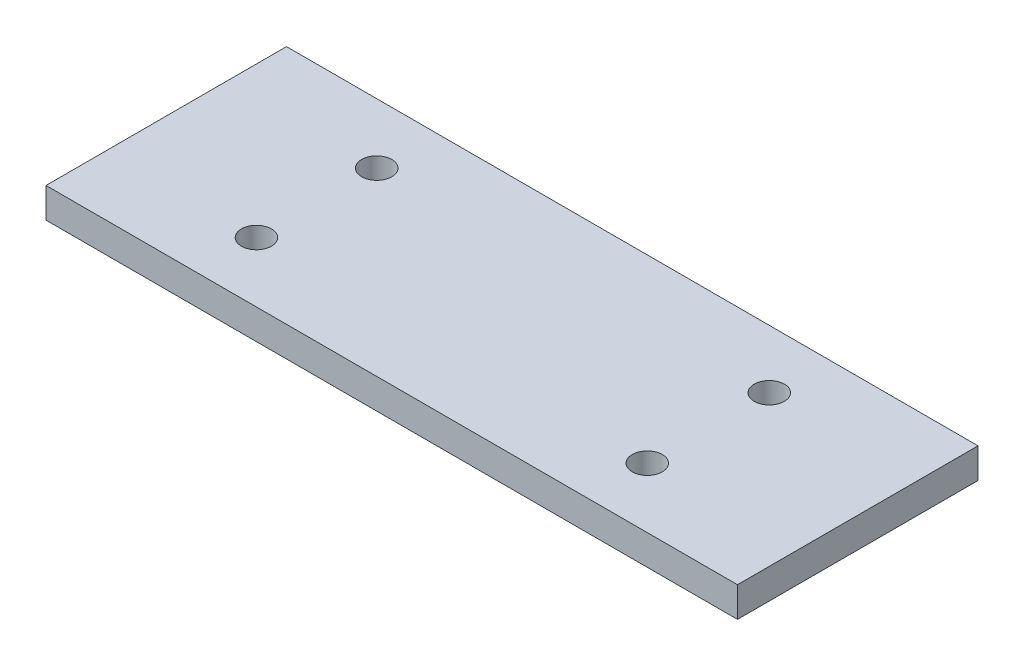
ISO-10303-21;
HEADER;
FILE_DESCRIPTION(('STEP AP214'),'2;1');
FILE_NAME('part.step','',(''),(''),'','','');
FILE_SCHEMA(('AUTOMOTIVE_DESIGN { 1 0 10303 214 1 1 1 1 }'));
ENDSEC;
DATA;
#1=APPLICATION_CONTEXT('core data for automotive mechanical design processes');
#2=APPLICATION_PROTOCOL_DEFINITION('international standard','automotive_design',2000,#1);
#3=PRODUCT_CONTEXT('',#1,'mechanical');
#4=PRODUCT('Part','Part','',(#3));
#5=PRODUCT_RELATED_PRODUCT_CATEGORY('part','',(#4));
#6=PRODUCT_DEFINITION_FORMATION('','',#4);
#7=PRODUCT_DEFINITION_CONTEXT('part definition',#1,'design');
#8=PRODUCT_DEFINITION('design','',#6,#7);
#9=PRODUCT_DEFINITION_SHAPE('','',#8);
#10=(LENGTH_UNIT() NAMED_UNIT(*) SI_UNIT(.MILLI.,.METRE.));
#11=(NAMED_UNIT(*) PLANE_ANGLE_UNIT() SI_UNIT($,.RADIAN.));
#12=(NAMED_UNIT(*) SI_UNIT($,.STERADIAN.) SOLID_ANGLE_UNIT());
#13=UNCERTAINTY_MEASURE_WITH_UNIT(LENGTH_MEASURE(1.E-05),#10,'distance_accuracy_value','');
#14=(GEOMETRIC_REPRESENTATION_CONTEXT(3) GLOBAL_UNCERTAINTY_ASSIGNED_CONTEXT((#13)) GLOBAL_UNIT_ASSIGNED_CONTEXT((#10,
#11,#12)) REPRESENTATION_CONTEXT('',''));
#15=CARTESIAN_POINT('',(0.,0.,0.));
#16=DIRECTION('',(0.,0.,1.));
#17=DIRECTION('',(1.,0.,0.));
#18=AXIS2_PLACEMENT_3D('',#15,#16,#17);
#19=CARTESIAN_POINT('',(57.5,2.5,-20.));
#20=DIRECTION('',(-1.,0.,0.));
#21=DIRECTION('',(0.,0.,1.));
#22=AXIS2_PLACEMENT_3D('',#19,#20,#21);
#23=PLANE('',#22);
#24=DIRECTION('',(0.,0.,-1.));
#25=VECTOR('',#24,1.);
#26=CARTESIAN_POINT('',(57.5,-2.5,-20.));
#27=LINE('',#26,#25);
#28=CARTESIAN_POINT('',(57.5,-2.5,20.));
#29=VERTEX_POINT('',#28);
#30=CARTESIAN_POINT('',(57.5,-2.5,-20.));
#31=VERTEX_POINT('',#30);
#32=EDGE_CURVE('E96',#29,#31,#27,.T.);
#33=ORIENTED_EDGE('',*,*,#32,.T.);
#34=DIRECTION('',(0.,-1.,0.));
#35=VECTOR('',#34,1.);
#36=CARTESIAN_POINT('',(57.5,2.5,-20.));
#37=LINE('',#36,#35);
#38=CARTESIAN_POINT('',(57.5,2.5,-20.));
#39=VERTEX_POINT('',#38);
#40=EDGE_CURVE('E11',#39,#31,#37,.T.);
#41=ORIENTED_EDGE('',*,*,#40,.F.);
#42=DIRECTION('',(0.,0.,-1.));
#43=VECTOR('',#42,1.);
#44=CARTESIAN_POINT('',(57.5,2.5,-20.));
#45=LINE('',#44,#43);
#46=CARTESIAN_POINT('',(57.5,2.5,20.));
#47=VERTEX_POINT('',#46);
#48=EDGE_CURVE('E84',#47,#39,#45,.T.);
#49=ORIENTED_EDGE('',*,*,#48,.F.);
#50=DIRECTION('',(0.,-1.,0.));
#51=VECTOR('',#50,1.);
#52=CARTESIAN_POINT('',(57.5,2.5,20.));
#53=LINE('',#52,#51);
#54=EDGE_CURVE('E92',#47,#29,#53,.T.);
#55=ORIENTED_EDGE('',*,*,#54,.T.);
#56=EDGE_LOOP('',(#33,#41,#49,#55));
#57=FACE_BOUND('',#56,.T.);
#58=ADVANCED_FACE('F33',(#57),#23,.F.);
#59=CARTESIAN_POINT('',(-57.5,2.5,-20.));
#60=DIRECTION('',(0.,0.,1.));
#61=DIRECTION('',(1.,0.,0.));
#62=AXIS2_PLACEMENT_3D('',#59,#60,#61);
#63=PLANE('',#62);
#64=DIRECTION('',(-1.,0.,0.));
#65=VECTOR('',#64,1.);
#66=CARTESIAN_POINT('',(-57.5,-2.5,-20.));
#67=LINE('',#66,#65);
#68=CARTESIAN_POINT('',(-57.5,-2.5,-20.));
#69=VERTEX_POINT('',#68);
#70=EDGE_CURVE('E88',#31,#69,#67,.T.);
#71=ORIENTED_EDGE('',*,*,#70,.T.);
#72=DIRECTION('',(0.,-1.,0.));
#73=VECTOR('',#72,1.);
#74=CARTESIAN_POINT('',(-57.5,2.5,-20.));
#75=LINE('',#74,#73);
#76=CARTESIAN_POINT('',(-57.5,2.5,-20.));
#77=VERTEX_POINT('',#76);
#78=EDGE_CURVE('E41',#77,#69,#75,.T.);
#79=ORIENTED_EDGE('',*,*,#78,.F.);
#80=DIRECTION('',(-1.,0.,0.));
#81=VECTOR('',#80,1.);
#82=CARTESIAN_POINT('',(-57.5,2.5,-20.));
#83=LINE('',#82,#81);
#84=EDGE_CURVE('E79',#39,#77,#83,.T.);
#85=ORIENTED_EDGE('',*,*,#84,.F.);
#86=ORIENTED_EDGE('',*,*,#40,.T.);
#87=EDGE_LOOP('',(#71,#79,#85,#86));
#88=FACE_BOUND('',#87,.T.);
#89=ADVANCED_FACE('F87',(#88),#63,.F.);
#90=CARTESIAN_POINT('',(-57.5,2.5,-20.));
#91=DIRECTION('',(1.,0.,0.));
#92=DIRECTION('',(0.,0.,-1.));
#93=AXIS2_PLACEMENT_3D('',#90,#91,#92);
#94=PLANE('',#93);
#95=DIRECTION('',(0.,0.,1.));
#96=VECTOR('',#95,1.);
#97=CARTESIAN_POINT('',(-57.5,-2.5,-20.));
#98=LINE('',#97,#96);
#99=CARTESIAN_POINT('',(-57.5,-2.5,20.));
#100=VERTEX_POINT('',#99);
#101=EDGE_CURVE('E66',#69,#100,#98,.T.);
#102=ORIENTED_EDGE('',*,*,#101,.T.);
#103=DIRECTION('',(0.,-1.,0.));
#104=VECTOR('',#103,1.);
#105=CARTESIAN_POINT('',(-57.5,2.5,20.));
#106=LINE('',#105,#104);
#107=CARTESIAN_POINT('',(-57.5,2.5,20.));
#108=VERTEX_POINT('',#107);
#109=EDGE_CURVE('E89',#108,#100,#106,.T.);
#110=ORIENTED_EDGE('',*,*,#109,.F.);
#111=DIRECTION('',(0.,0.,1.));
#112=VECTOR('',#111,1.);
#113=CARTESIAN_POINT('',(-57.5,2.5,-20.));
#114=LINE('',#113,#112);
#115=EDGE_CURVE('E82',#77,#108,#114,.T.);
#116=ORIENTED_EDGE('',*,*,#115,.F.);
#117=ORIENTED_EDGE('',*,*,#78,.T.);
#118=EDGE_LOOP('',(#102,#110,#116,#117));
#119=FACE_BOUND('',#118,.T.);
#120=ADVANCED_FACE('F90',(#119),#94,.F.);
#121=CARTESIAN_POINT('',(-57.5,2.5,20.));
#122=DIRECTION('',(0.,0.,-1.));
#123=DIRECTION('',(-1.,0.,0.));
#124=AXIS2_PLACEMENT_3D('',#121,#122,#123);
#125=PLANE('',#124);
#126=DIRECTION('',(1.,0.,0.));
#127=VECTOR('',#126,1.);
#128=CARTESIAN_POINT('',(-57.5,-2.5,20.));
#129=LINE('',#128,#127);
#130=EDGE_CURVE('E72',#100,#29,#129,.T.);
#131=ORIENTED_EDGE('',*,*,#130,.T.);
#132=ORIENTED_EDGE('',*,*,#54,.F.);
#133=DIRECTION('',(1.,0.,0.));
#134=VECTOR('',#133,1.);
#135=CARTESIAN_POINT('',(-57.5,2.5,20.));
#136=LINE('',#135,#134);
#137=EDGE_CURVE('E49',#108,#47,#136,.T.);
#138=ORIENTED_EDGE('',*,*,#137,.F.);
#139=ORIENTED_EDGE('',*,*,#109,.T.);
#140=EDGE_LOOP('',(#131,#132,#138,#139));
#141=FACE_BOUND('',#140,.T.);
#142=ADVANCED_FACE('F104',(#141),#125,.F.);
#143=CARTESIAN_POINT('',(0.,2.5,0.));
#144=DIRECTION('',(0.,1.,0.));
#145=DIRECTION('',(0.,0.,1.));
#146=AXIS2_PLACEMENT_3D('',#143,#144,#145);
#147=PLANE('',#146);
#148=CARTESIAN_POINT('',(-32.5,2.5,-10.));
#149=DIRECTION('',(0.,1.,0.));
#150=DIRECTION('',(0.,0.,1.));
#151=AXIS2_PLACEMENT_3D('',#148,#149,#150);
#152=CIRCLE('',#151,2.5);
#153=CARTESIAN_POINT('',(-32.5,2.5,-7.50000000000002));
#154=VERTEX_POINT('',#153);
#155=EDGE_CURVE('E130',#154,#154,#152,.T.);
#156=ORIENTED_EDGE('',*,*,#155,.F.);
#157=EDGE_LOOP('',(#156));
#158=FACE_BOUND('',#157,.T.);
#159=CARTESIAN_POINT('',(-32.5,2.5,9.99999999999999));
#160=DIRECTION('',(0.,1.,0.));
#161=DIRECTION('',(0.,0.,1.));
#162=AXIS2_PLACEMENT_3D('',#159,#160,#161);
#163=CIRCLE('',#162,2.5);
#164=CARTESIAN_POINT('',(-32.5,2.5,12.5));
#165=VERTEX_POINT('',#164);
#166=EDGE_CURVE('E124',#165,#165,#163,.T.);
#167=ORIENTED_EDGE('',*,*,#166,.F.);
#168=EDGE_LOOP('',(#167));
#169=FACE_BOUND('',#168,.T.);
#170=CARTESIAN_POINT('',(32.5,2.5,9.99999999999999));
#171=DIRECTION('',(0.,1.,0.));
#172=DIRECTION('',(0.,0.,1.));
#173=AXIS2_PLACEMENT_3D('',#170,#171,#172);
#174=CIRCLE('',#173,2.5);
#175=CARTESIAN_POINT('',(32.5,2.5,12.5));
#176=VERTEX_POINT('',#175);
#177=EDGE_CURVE('E118',#176,#176,#174,.T.);
#178=ORIENTED_EDGE('',*,*,#177,.F.);
#179=EDGE_LOOP('',(#178));
#180=FACE_BOUND('',#179,.T.);
#181=CARTESIAN_POINT('',(32.5,2.5,-10.2905183854887));
#182=DIRECTION('',(0.,1.,0.));
#183=DIRECTION('',(0.,0.,1.));
#184=AXIS2_PLACEMENT_3D('',#181,#182,#183);
#185=CIRCLE('',#184,2.5);
#186=CARTESIAN_POINT('',(32.5,2.5,-7.79051838548869));
#187=VERTEX_POINT('',#186);
#188=EDGE_CURVE('E112',#187,#187,#185,.T.);
#189=ORIENTED_EDGE('',*,*,#188,.F.);
#190=EDGE_LOOP('',(#189));
#191=FACE_BOUND('',#190,.T.);
#192=ORIENTED_EDGE('',*,*,#48,.T.);
#193=ORIENTED_EDGE('',*,*,#84,.T.);
#194=ORIENTED_EDGE('',*,*,#115,.T.);
#195=ORIENTED_EDGE('',*,*,#137,.T.);
#196=EDGE_LOOP('',(#192,#193,#194,#195));
#197=FACE_BOUND('',#196,.T.);
#198=ADVANCED_FACE('F80',(#158,#169,#180,#191,#197),#147,.T.);
#199=CARTESIAN_POINT('',(0.,-2.5,0.));
#200=DIRECTION('',(0.,1.,0.));
#201=DIRECTION('',(0.,0.,1.));
#202=AXIS2_PLACEMENT_3D('',#199,#200,#201);
#203=PLANE('',#202);
#204=CARTESIAN_POINT('',(-32.5,-2.5,-10.));
#205=DIRECTION('',(0.,1.,0.));
#206=DIRECTION('',(0.,0.,1.));
#207=AXIS2_PLACEMENT_3D('',#204,#205,#206);
#208=CIRCLE('',#207,2.5);
#209=CARTESIAN_POINT('',(-32.5,-2.5,-7.50000000000002));
#210=VERTEX_POINT('',#209);
#211=EDGE_CURVE('E127',#210,#210,#208,.T.);
#212=ORIENTED_EDGE('',*,*,#211,.T.);
#213=EDGE_LOOP('',(#212));
#214=FACE_BOUND('',#213,.T.);
#215=CARTESIAN_POINT('',(-32.5,-2.5,9.99999999999999));
#216=DIRECTION('',(0.,1.,0.));
#217=DIRECTION('',(0.,0.,1.));
#218=AXIS2_PLACEMENT_3D('',#215,#216,#217);
#219=CIRCLE('',#218,2.5);
#220=CARTESIAN_POINT('',(-32.5,-2.5,12.5));
#221=VERTEX_POINT('',#220);
#222=EDGE_CURVE('E121',#221,#221,#219,.T.);
#223=ORIENTED_EDGE('',*,*,#222,.T.);
#224=EDGE_LOOP('',(#223));
#225=FACE_BOUND('',#224,.T.);
#226=CARTESIAN_POINT('',(32.5,-2.5,9.99999999999999));
#227=DIRECTION('',(0.,1.,0.));
#228=DIRECTION('',(0.,0.,1.));
#229=AXIS2_PLACEMENT_3D('',#226,#227,#228);
#230=CIRCLE('',#229,2.5);
#231=CARTESIAN_POINT('',(32.5,-2.5,12.5));
#232=VERTEX_POINT('',#231);
#233=EDGE_CURVE('E115',#232,#232,#230,.T.);
#234=ORIENTED_EDGE('',*,*,#233,.T.);
#235=EDGE_LOOP('',(#234));
#236=FACE_BOUND('',#235,.T.);
#237=CARTESIAN_POINT('',(32.5,-2.5,-10.2905183854887));
#238=DIRECTION('',(0.,1.,0.));
#239=DIRECTION('',(0.,0.,1.));
#240=AXIS2_PLACEMENT_3D('',#237,#238,#239);
#241=CIRCLE('',#240,2.5);
#242=CARTESIAN_POINT('',(32.5,-2.5,-7.79051838548869));
#243=VERTEX_POINT('',#242);
#244=EDGE_CURVE('E99',#243,#243,#241,.T.);
#245=ORIENTED_EDGE('',*,*,#244,.T.);
#246=EDGE_LOOP('',(#245));
#247=FACE_BOUND('',#246,.T.);
#248=ORIENTED_EDGE('',*,*,#32,.F.);
#249=ORIENTED_EDGE('',*,*,#130,.F.);
#250=ORIENTED_EDGE('',*,*,#101,.F.);
#251=ORIENTED_EDGE('',*,*,#70,.F.);
#252=EDGE_LOOP('',(#248,#249,#250,#251));
#253=FACE_BOUND('',#252,.T.);
#254=ADVANCED_FACE('F107',(#214,#225,#236,#247,#253),#203,.F.);
#255=CARTESIAN_POINT('',(32.5,2.5,-10.2905183854887));
#256=DIRECTION('',(0.,1.,0.));
#257=DIRECTION('',(0.,0.,1.));
#258=AXIS2_PLACEMENT_3D('',#255,#256,#257);
#259=CYLINDRICAL_SURFACE('',#258,2.5);
#260=ORIENTED_EDGE('',*,*,#244,.F.);
#261=EDGE_LOOP('',(#260));
#262=FACE_BOUND('',#261,.T.);
#263=ORIENTED_EDGE('',*,*,#188,.T.);
#264=EDGE_LOOP('',(#263));
#265=FACE_BOUND('',#264,.T.);
#266=ADVANCED_FACE('F145',(#262,#265),#259,.F.);
#267=CARTESIAN_POINT('',(32.5,2.5,9.99999999999999));
#268=DIRECTION('',(0.,1.,0.));
#269=DIRECTION('',(0.,0.,1.));
#270=AXIS2_PLACEMENT_3D('',#267,#268,#269);
#271=CYLINDRICAL_SURFACE('',#270,2.5);
#272=ORIENTED_EDGE('',*,*,#233,.F.);
#273=EDGE_LOOP('',(#272));
#274=FACE_BOUND('',#273,.T.);
#275=ORIENTED_EDGE('',*,*,#177,.T.);
#276=EDGE_LOOP('',(#275));
#277=FACE_BOUND('',#276,.T.);
#278=ADVANCED_FACE('F147',(#274,#277),#271,.F.);
#279=CARTESIAN_POINT('',(-32.5,2.5,9.99999999999999));
#280=DIRECTION('',(0.,1.,0.));
#281=DIRECTION('',(0.,0.,1.));
#282=AXIS2_PLACEMENT_3D('',#279,#280,#281);
#283=CYLINDRICAL_SURFACE('',#282,2.5);
#284=ORIENTED_EDGE('',*,*,#222,.F.);
#285=EDGE_LOOP('',(#284));
#286=FACE_BOUND('',#285,.T.);
#287=ORIENTED_EDGE('',*,*,#166,.T.);
#288=EDGE_LOOP('',(#287));
#289=FACE_BOUND('',#288,.T.);
#290=ADVANCED_FACE('F154',(#286,#289),#283,.F.);
#291=CARTESIAN_POINT('',(-32.5,2.5,-10.));
#292=DIRECTION('',(0.,1.,0.));
#293=DIRECTION('',(0.,0.,1.));
#294=AXIS2_PLACEMENT_3D('',#291,#292,#293);
#295=CYLINDRICAL_SURFACE('',#294,2.5);
#296=ORIENTED_EDGE('',*,*,#211,.F.);
#297=EDGE_LOOP('',(#296));
#298=FACE_BOUND('',#297,.T.);
#299=ORIENTED_EDGE('',*,*,#155,.T.);
#300=EDGE_LOOP('',(#299));
#301=FACE_BOUND('',#300,.T.);
#302=ADVANCED_FACE('F134',(#298,#301),#295,.F.);
#303=CLOSED_SHELL('',(#58,#89,#120,#142,#198,#254,#266,#278,#290,#302));
#304=MANIFOLD_SOLID_BREP('B2',#303);
#305=ADVANCED_BREP_SHAPE_REPRESENTATION('',(#18,#304),#14);
#306=SHAPE_DEFINITION_REPRESENTATION(#9,#305);
ENDSEC;
END-ISO-10303-21;
